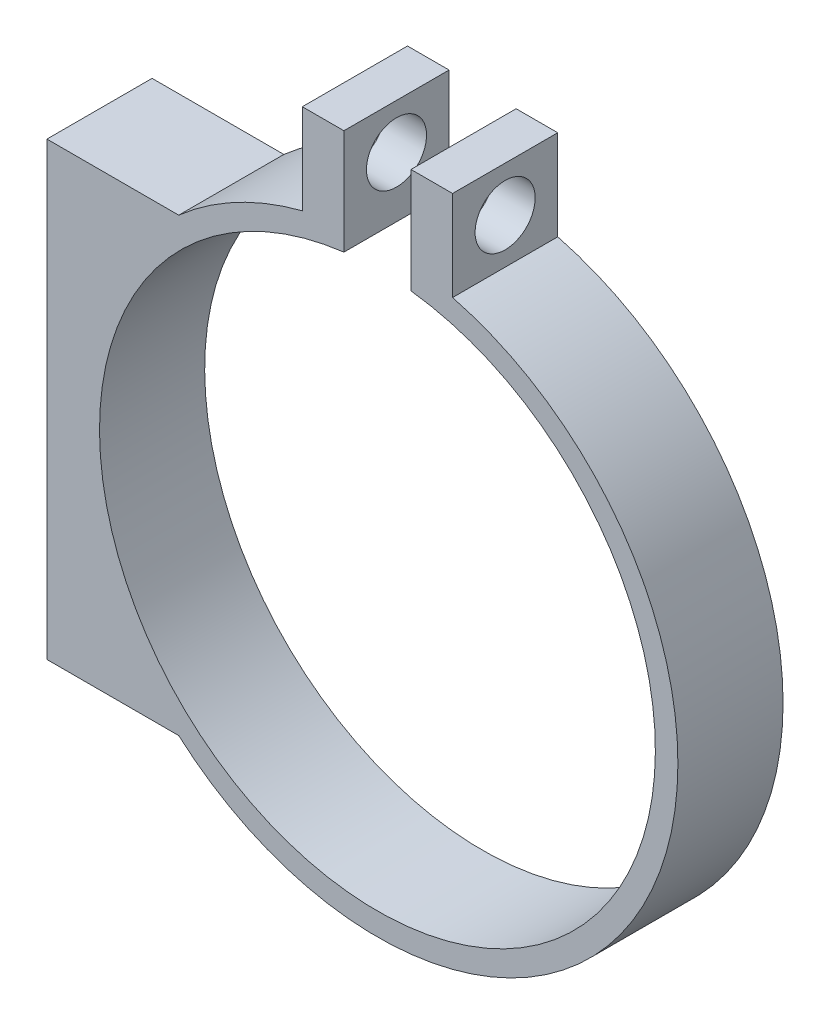
ISO-10303-21;
HEADER;
FILE_DESCRIPTION(('STEP AP214'),'2;1');
FILE_NAME('part.step','',(''),(''),'','','');
FILE_SCHEMA(('AUTOMOTIVE_DESIGN { 1 0 10303 214 1 1 1 1 }'));
ENDSEC;
DATA;
#1=APPLICATION_CONTEXT('core data for automotive mechanical design processes');
#2=APPLICATION_PROTOCOL_DEFINITION('international standard','automotive_design',2000,#1);
#3=PRODUCT_CONTEXT('',#1,'mechanical');
#4=PRODUCT('Part','Part','',(#3));
#5=PRODUCT_RELATED_PRODUCT_CATEGORY('part','',(#4));
#6=PRODUCT_DEFINITION_FORMATION('','',#4);
#7=PRODUCT_DEFINITION_CONTEXT('part definition',#1,'design');
#8=PRODUCT_DEFINITION('design','',#6,#7);
#9=PRODUCT_DEFINITION_SHAPE('','',#8);
#10=(LENGTH_UNIT() NAMED_UNIT(*) SI_UNIT(.MILLI.,.METRE.));
#11=(NAMED_UNIT(*) PLANE_ANGLE_UNIT() SI_UNIT($,.RADIAN.));
#12=(NAMED_UNIT(*) SI_UNIT($,.STERADIAN.) SOLID_ANGLE_UNIT());
#13=UNCERTAINTY_MEASURE_WITH_UNIT(LENGTH_MEASURE(1.E-05),#10,'distance_accuracy_value','');
#14=(GEOMETRIC_REPRESENTATION_CONTEXT(3) GLOBAL_UNCERTAINTY_ASSIGNED_CONTEXT((#13)) GLOBAL_UNIT_ASSIGNED_CONTEXT((#10,
#11,#12)) REPRESENTATION_CONTEXT('',''));
#15=CARTESIAN_POINT('',(0.,0.,0.));
#16=DIRECTION('',(0.,0.,1.));
#17=DIRECTION('',(1.,0.,0.));
#18=AXIS2_PLACEMENT_3D('',#15,#16,#17);
#19=CARTESIAN_POINT('',(-2.23155404641568,25.3649167310371,7.));
#20=DIRECTION('',(-1.,0.,0.));
#21=DIRECTION('',(0.,-1.,0.));
#22=AXIS2_PLACEMENT_3D('',#19,#20,#21);
#23=PLANE('',#22);
#24=CARTESIAN_POINT('',(-2.23155404641568,22.3649167310371,3.5));
#25=DIRECTION('',(-1.,0.,0.));
#26=DIRECTION('',(0.,-1.,0.));
#27=AXIS2_PLACEMENT_3D('',#24,#25,#26);
#28=CIRCLE('',#27,2.);
#29=CARTESIAN_POINT('',(-2.23155404641568,20.3649167310371,3.5));
#30=VERTEX_POINT('',#29);
#31=EDGE_CURVE('E265',#30,#30,#28,.T.);
#32=ORIENTED_EDGE('',*,*,#31,.T.);
#33=EDGE_LOOP('',(#32));
#34=FACE_BOUND('',#33,.T.);
#35=DIRECTION('',(0.,1.,0.));
#36=VECTOR('',#35,1.);
#37=CARTESIAN_POINT('',(-2.23155404641568,25.3649167310371,0.));
#38=LINE('',#37,#36);
#39=CARTESIAN_POINT('',(-2.23155404641568,18.3649167310371,0.));
#40=VERTEX_POINT('',#39);
#41=CARTESIAN_POINT('',(-2.23155404641568,25.3649167310371,0.));
#42=VERTEX_POINT('',#41);
#43=EDGE_CURVE('E155',#40,#42,#38,.T.);
#44=ORIENTED_EDGE('',*,*,#43,.T.);
#45=DIRECTION('',(0.,0.,-1.));
#46=VECTOR('',#45,1.);
#47=CARTESIAN_POINT('',(-2.23155404641568,25.3649167310371,7.));
#48=LINE('',#47,#46);
#49=CARTESIAN_POINT('',(-2.23155404641568,25.3649167310371,7.));
#50=VERTEX_POINT('',#49);
#51=EDGE_CURVE('E11',#50,#42,#48,.T.);
#52=ORIENTED_EDGE('',*,*,#51,.F.);
#53=DIRECTION('',(0.,1.,0.));
#54=VECTOR('',#53,1.);
#55=CARTESIAN_POINT('',(-2.23155404641568,25.3649167310371,7.));
#56=LINE('',#55,#54);
#57=CARTESIAN_POINT('',(-2.23155404641568,18.3649167310371,7.));
#58=VERTEX_POINT('',#57);
#59=EDGE_CURVE('E178',#58,#50,#56,.T.);
#60=ORIENTED_EDGE('',*,*,#59,.F.);
#61=DIRECTION('',(0.,0.,-1.));
#62=VECTOR('',#61,1.);
#63=CARTESIAN_POINT('',(-2.23155404641568,18.3649167310371,7.));
#64=LINE('',#63,#62);
#65=EDGE_CURVE('E151',#58,#40,#64,.T.);
#66=ORIENTED_EDGE('',*,*,#65,.T.);
#67=EDGE_LOOP('',(#44,#52,#60,#66));
#68=FACE_BOUND('',#67,.T.);
#69=ADVANCED_FACE('F34',(#34,#68),#23,.F.);
#70=CARTESIAN_POINT('',(-5.,25.3649167310371,7.));
#71=DIRECTION('',(0.,-1.,0.));
#72=DIRECTION('',(0.,0.,-1.));
#73=AXIS2_PLACEMENT_3D('',#70,#71,#72);
#74=PLANE('',#73);
#75=DIRECTION('',(-1.,0.,0.));
#76=VECTOR('',#75,1.);
#77=CARTESIAN_POINT('',(-5.,25.3649167310371,0.));
#78=LINE('',#77,#76);
#79=CARTESIAN_POINT('',(-5.,25.3649167310371,0.));
#80=VERTEX_POINT('',#79);
#81=EDGE_CURVE('E158',#42,#80,#78,.T.);
#82=ORIENTED_EDGE('',*,*,#81,.T.);
#83=DIRECTION('',(0.,0.,-1.));
#84=VECTOR('',#83,1.);
#85=CARTESIAN_POINT('',(-5.,25.3649167310371,7.));
#86=LINE('',#85,#84);
#87=CARTESIAN_POINT('',(-5.,25.3649167310371,7.));
#88=VERTEX_POINT('',#87);
#89=EDGE_CURVE('E43',#88,#80,#86,.T.);
#90=ORIENTED_EDGE('',*,*,#89,.F.);
#91=DIRECTION('',(-1.,0.,0.));
#92=VECTOR('',#91,1.);
#93=CARTESIAN_POINT('',(-5.,25.3649167310371,7.));
#94=LINE('',#93,#92);
#95=EDGE_CURVE('E106',#50,#88,#94,.T.);
#96=ORIENTED_EDGE('',*,*,#95,.F.);
#97=ORIENTED_EDGE('',*,*,#51,.T.);
#98=EDGE_LOOP('',(#82,#90,#96,#97));
#99=FACE_BOUND('',#98,.T.);
#100=ADVANCED_FACE('F258',(#99),#74,.F.);
#101=CARTESIAN_POINT('',(-5.,19.3649167310371,7.));
#102=DIRECTION('',(1.,0.,0.));
#103=DIRECTION('',(0.,1.,0.));
#104=AXIS2_PLACEMENT_3D('',#101,#102,#103);
#105=PLANE('',#104);
#106=CARTESIAN_POINT('',(-5.,22.3649167310371,3.5));
#107=DIRECTION('',(-1.,0.,0.));
#108=DIRECTION('',(0.,-1.,0.));
#109=AXIS2_PLACEMENT_3D('',#106,#107,#108);
#110=CIRCLE('',#109,2.);
#111=CARTESIAN_POINT('',(-5.,20.3649167310371,3.5));
#112=VERTEX_POINT('',#111);
#113=EDGE_CURVE('E322',#112,#112,#110,.T.);
#114=ORIENTED_EDGE('',*,*,#113,.F.);
#115=EDGE_LOOP('',(#114));
#116=FACE_BOUND('',#115,.T.);
#117=DIRECTION('',(0.,-1.,0.));
#118=VECTOR('',#117,1.);
#119=CARTESIAN_POINT('',(-5.,19.3649167310371,0.));
#120=LINE('',#119,#118);
#121=CARTESIAN_POINT('',(-5.,19.3649167310371,0.));
#122=VERTEX_POINT('',#121);
#123=EDGE_CURVE('E161',#80,#122,#120,.T.);
#124=ORIENTED_EDGE('',*,*,#123,.T.);
#125=DIRECTION('',(0.,0.,-1.));
#126=VECTOR('',#125,1.);
#127=CARTESIAN_POINT('',(-5.,19.3649167310371,7.));
#128=LINE('',#127,#126);
#129=CARTESIAN_POINT('',(-5.,19.3649167310371,7.));
#130=VERTEX_POINT('',#129);
#131=EDGE_CURVE('E197',#130,#122,#128,.T.);
#132=ORIENTED_EDGE('',*,*,#131,.F.);
#133=DIRECTION('',(0.,-1.,0.));
#134=VECTOR('',#133,1.);
#135=CARTESIAN_POINT('',(-5.,19.3649167310371,7.));
#136=LINE('',#135,#134);
#137=EDGE_CURVE('E206',#88,#130,#136,.T.);
#138=ORIENTED_EDGE('',*,*,#137,.F.);
#139=ORIENTED_EDGE('',*,*,#89,.T.);
#140=EDGE_LOOP('',(#124,#132,#138,#139));
#141=FACE_BOUND('',#140,.T.);
#142=ADVANCED_FACE('F204',(#116,#141),#105,.F.);
#143=CARTESIAN_POINT('',(0.,0.,7.));
#144=DIRECTION('',(0.,0.,-1.));
#145=DIRECTION('',(-1.,0.,0.));
#146=AXIS2_PLACEMENT_3D('',#143,#144,#145);
#147=CYLINDRICAL_SURFACE('',#146,20.);
#148=CARTESIAN_POINT('',(0.,0.,0.));
#149=DIRECTION('',(0.,0.,1.));
#150=DIRECTION('',(1.,0.,0.));
#151=AXIS2_PLACEMENT_3D('',#148,#149,#150);
#152=CIRCLE('',#151,20.);
#153=CARTESIAN_POINT('',(-13.228756555323,15.,0.));
#154=VERTEX_POINT('',#153);
#155=EDGE_CURVE('E163',#122,#154,#152,.T.);
#156=ORIENTED_EDGE('',*,*,#155,.T.);
#157=DIRECTION('',(0.,0.,-1.));
#158=VECTOR('',#157,1.);
#159=CARTESIAN_POINT('',(-13.228756555323,15.,7.));
#160=LINE('',#159,#158);
#161=CARTESIAN_POINT('',(-13.228756555323,15.,7.));
#162=VERTEX_POINT('',#161);
#163=EDGE_CURVE('E194',#162,#154,#160,.T.);
#164=ORIENTED_EDGE('',*,*,#163,.F.);
#165=CARTESIAN_POINT('',(0.,0.,7.));
#166=DIRECTION('',(0.,0.,1.));
#167=DIRECTION('',(1.,0.,0.));
#168=AXIS2_PLACEMENT_3D('',#165,#166,#167);
#169=CIRCLE('',#168,20.);
#170=EDGE_CURVE('E224',#130,#162,#169,.T.);
#171=ORIENTED_EDGE('',*,*,#170,.F.);
#172=ORIENTED_EDGE('',*,*,#131,.T.);
#173=EDGE_LOOP('',(#156,#164,#171,#172));
#174=FACE_BOUND('',#173,.T.);
#175=ADVANCED_FACE('F215',(#174),#147,.T.);
#176=CARTESIAN_POINT('',(-22.,15.,7.));
#177=DIRECTION('',(0.,-1.,0.));
#178=DIRECTION('',(0.,0.,-1.));
#179=AXIS2_PLACEMENT_3D('',#176,#177,#178);
#180=PLANE('',#179);
#181=DIRECTION('',(-1.,0.,0.));
#182=VECTOR('',#181,1.);
#183=CARTESIAN_POINT('',(-22.,15.,0.));
#184=LINE('',#183,#182);
#185=CARTESIAN_POINT('',(-22.,15.,0.));
#186=VERTEX_POINT('',#185);
#187=EDGE_CURVE('E165',#154,#186,#184,.T.);
#188=ORIENTED_EDGE('',*,*,#187,.T.);
#189=DIRECTION('',(0.,0.,-1.));
#190=VECTOR('',#189,1.);
#191=CARTESIAN_POINT('',(-22.,15.,7.));
#192=LINE('',#191,#190);
#193=CARTESIAN_POINT('',(-22.,15.,7.));
#194=VERTEX_POINT('',#193);
#195=EDGE_CURVE('E191',#194,#186,#192,.T.);
#196=ORIENTED_EDGE('',*,*,#195,.F.);
#197=DIRECTION('',(-1.,0.,0.));
#198=VECTOR('',#197,1.);
#199=CARTESIAN_POINT('',(-22.,15.,7.));
#200=LINE('',#199,#198);
#201=EDGE_CURVE('E221',#162,#194,#200,.T.);
#202=ORIENTED_EDGE('',*,*,#201,.F.);
#203=ORIENTED_EDGE('',*,*,#163,.T.);
#204=EDGE_LOOP('',(#188,#196,#202,#203));
#205=FACE_BOUND('',#204,.T.);
#206=ADVANCED_FACE('F219',(#205),#180,.F.);
#207=CARTESIAN_POINT('',(-22.,-15.,7.));
#208=DIRECTION('',(1.,0.,0.));
#209=DIRECTION('',(0.,0.,-1.));
#210=AXIS2_PLACEMENT_3D('',#207,#208,#209);
#211=PLANE('',#210);
#212=CARTESIAN_POINT('',(-22.,12.5,3.5));
#213=DIRECTION('',(-1.,0.,0.));
#214=DIRECTION('',(0.,0.,1.));
#215=AXIS2_PLACEMENT_3D('',#212,#213,#214);
#216=CIRCLE('',#215,1.75);
#217=CARTESIAN_POINT('',(-22.,12.5,5.25));
#218=VERTEX_POINT('',#217);
#219=EDGE_CURVE('E279',#218,#218,#216,.T.);
#220=ORIENTED_EDGE('',*,*,#219,.F.);
#221=EDGE_LOOP('',(#220));
#222=FACE_BOUND('',#221,.T.);
#223=CARTESIAN_POINT('',(-22.,-12.5,3.5));
#224=DIRECTION('',(-1.,0.,0.));
#225=DIRECTION('',(0.,0.,1.));
#226=AXIS2_PLACEMENT_3D('',#223,#224,#225);
#227=CIRCLE('',#226,1.75);
#228=CARTESIAN_POINT('',(-22.,-12.5,5.25));
#229=VERTEX_POINT('',#228);
#230=EDGE_CURVE('E267',#229,#229,#227,.T.);
#231=ORIENTED_EDGE('',*,*,#230,.F.);
#232=EDGE_LOOP('',(#231));
#233=FACE_BOUND('',#232,.T.);
#234=DIRECTION('',(0.,-1.,0.));
#235=VECTOR('',#234,1.);
#236=CARTESIAN_POINT('',(-22.,-15.,0.));
#237=LINE('',#236,#235);
#238=CARTESIAN_POINT('',(-22.,-15.,0.));
#239=VERTEX_POINT('',#238);
#240=EDGE_CURVE('E167',#186,#239,#237,.T.);
#241=ORIENTED_EDGE('',*,*,#240,.T.);
#242=DIRECTION('',(0.,0.,-1.));
#243=VECTOR('',#242,1.);
#244=CARTESIAN_POINT('',(-22.,-15.,7.));
#245=LINE('',#244,#243);
#246=CARTESIAN_POINT('',(-22.,-15.,7.));
#247=VERTEX_POINT('',#246);
#248=EDGE_CURVE('E188',#247,#239,#245,.T.);
#249=ORIENTED_EDGE('',*,*,#248,.F.);
#250=DIRECTION('',(0.,-1.,0.));
#251=VECTOR('',#250,1.);
#252=CARTESIAN_POINT('',(-22.,-15.,7.));
#253=LINE('',#252,#251);
#254=EDGE_CURVE('E223',#194,#247,#253,.T.);
#255=ORIENTED_EDGE('',*,*,#254,.F.);
#256=ORIENTED_EDGE('',*,*,#195,.T.);
#257=EDGE_LOOP('',(#241,#249,#255,#256));
#258=FACE_BOUND('',#257,.T.);
#259=ADVANCED_FACE('F295',(#222,#233,#258),#211,.F.);
#260=CARTESIAN_POINT('',(-22.,-15.,7.));
#261=DIRECTION('',(0.,1.,0.));
#262=DIRECTION('',(0.,0.,1.));
#263=AXIS2_PLACEMENT_3D('',#260,#261,#262);
#264=PLANE('',#263);
#265=DIRECTION('',(1.,0.,0.));
#266=VECTOR('',#265,1.);
#267=CARTESIAN_POINT('',(-22.,-15.,0.));
#268=LINE('',#267,#266);
#269=CARTESIAN_POINT('',(-13.228756555323,-15.,0.));
#270=VERTEX_POINT('',#269);
#271=EDGE_CURVE('E169',#239,#270,#268,.T.);
#272=ORIENTED_EDGE('',*,*,#271,.T.);
#273=DIRECTION('',(0.,0.,-1.));
#274=VECTOR('',#273,1.);
#275=CARTESIAN_POINT('',(-13.228756555323,-15.,7.));
#276=LINE('',#275,#274);
#277=CARTESIAN_POINT('',(-13.228756555323,-15.,7.));
#278=VERTEX_POINT('',#277);
#279=EDGE_CURVE('E185',#278,#270,#276,.T.);
#280=ORIENTED_EDGE('',*,*,#279,.F.);
#281=DIRECTION('',(1.,0.,0.));
#282=VECTOR('',#281,1.);
#283=CARTESIAN_POINT('',(-22.,-15.,7.));
#284=LINE('',#283,#282);
#285=EDGE_CURVE('E226',#247,#278,#284,.T.);
#286=ORIENTED_EDGE('',*,*,#285,.F.);
#287=ORIENTED_EDGE('',*,*,#248,.T.);
#288=EDGE_LOOP('',(#272,#280,#286,#287));
#289=FACE_BOUND('',#288,.T.);
#290=ADVANCED_FACE('F298',(#289),#264,.F.);
#291=CARTESIAN_POINT('',(0.,0.,7.));
#292=DIRECTION('',(0.,0.,-1.));
#293=DIRECTION('',(-1.,0.,0.));
#294=AXIS2_PLACEMENT_3D('',#291,#292,#293);
#295=CYLINDRICAL_SURFACE('',#294,20.);
#296=CARTESIAN_POINT('',(0.,0.,0.));
#297=DIRECTION('',(0.,0.,1.));
#298=DIRECTION('',(1.,0.,0.));
#299=AXIS2_PLACEMENT_3D('',#296,#297,#298);
#300=CIRCLE('',#299,20.);
#301=CARTESIAN_POINT('',(5.,19.3649167310371,0.));
#302=VERTEX_POINT('',#301);
#303=EDGE_CURVE('E171',#270,#302,#300,.T.);
#304=ORIENTED_EDGE('',*,*,#303,.T.);
#305=DIRECTION('',(0.,0.,-1.));
#306=VECTOR('',#305,1.);
#307=CARTESIAN_POINT('',(5.,19.3649167310371,7.));
#308=LINE('',#307,#306);
#309=CARTESIAN_POINT('',(5.,19.3649167310371,7.));
#310=VERTEX_POINT('',#309);
#311=EDGE_CURVE('E182',#310,#302,#308,.T.);
#312=ORIENTED_EDGE('',*,*,#311,.F.);
#313=CARTESIAN_POINT('',(0.,0.,7.));
#314=DIRECTION('',(0.,0.,1.));
#315=DIRECTION('',(1.,0.,0.));
#316=AXIS2_PLACEMENT_3D('',#313,#314,#315);
#317=CIRCLE('',#316,20.);
#318=EDGE_CURVE('E232',#278,#310,#317,.T.);
#319=ORIENTED_EDGE('',*,*,#318,.F.);
#320=ORIENTED_EDGE('',*,*,#279,.T.);
#321=EDGE_LOOP('',(#304,#312,#319,#320));
#322=FACE_BOUND('',#321,.T.);
#323=ADVANCED_FACE('F238',(#322),#295,.T.);
#324=CARTESIAN_POINT('',(5.,25.3649167310371,7.));
#325=DIRECTION('',(-1.,0.,0.));
#326=DIRECTION('',(0.,-1.,0.));
#327=AXIS2_PLACEMENT_3D('',#324,#325,#326);
#328=PLANE('',#327);
#329=CARTESIAN_POINT('',(5.,22.3649167310371,3.5));
#330=DIRECTION('',(-1.,0.,0.));
#331=DIRECTION('',(0.,-1.,0.));
#332=AXIS2_PLACEMENT_3D('',#329,#330,#331);
#333=CIRCLE('',#332,2.);
#334=CARTESIAN_POINT('',(5.,20.3649167310371,3.5));
#335=VERTEX_POINT('',#334);
#336=EDGE_CURVE('E268',#335,#335,#333,.T.);
#337=ORIENTED_EDGE('',*,*,#336,.T.);
#338=EDGE_LOOP('',(#337));
#339=FACE_BOUND('',#338,.T.);
#340=DIRECTION('',(0.,1.,0.));
#341=VECTOR('',#340,1.);
#342=CARTESIAN_POINT('',(5.,25.3649167310371,0.));
#343=LINE('',#342,#341);
#344=CARTESIAN_POINT('',(5.,25.3649167310371,0.));
#345=VERTEX_POINT('',#344);
#346=EDGE_CURVE('E173',#302,#345,#343,.T.);
#347=ORIENTED_EDGE('',*,*,#346,.T.);
#348=DIRECTION('',(0.,0.,-1.));
#349=VECTOR('',#348,1.);
#350=CARTESIAN_POINT('',(5.,25.3649167310371,7.));
#351=LINE('',#350,#349);
#352=CARTESIAN_POINT('',(5.,25.3649167310371,7.));
#353=VERTEX_POINT('',#352);
#354=EDGE_CURVE('E146',#353,#345,#351,.T.);
#355=ORIENTED_EDGE('',*,*,#354,.F.);
#356=DIRECTION('',(0.,1.,0.));
#357=VECTOR('',#356,1.);
#358=CARTESIAN_POINT('',(5.,25.3649167310371,7.));
#359=LINE('',#358,#357);
#360=EDGE_CURVE('E137',#310,#353,#359,.T.);
#361=ORIENTED_EDGE('',*,*,#360,.F.);
#362=ORIENTED_EDGE('',*,*,#311,.T.);
#363=EDGE_LOOP('',(#347,#355,#361,#362));
#364=FACE_BOUND('',#363,.T.);
#365=ADVANCED_FACE('F242',(#339,#364),#328,.F.);
#366=CARTESIAN_POINT('',(2.23155404641567,25.3649167310371,7.));
#367=DIRECTION('',(0.,-1.,0.));
#368=DIRECTION('',(0.,0.,-1.));
#369=AXIS2_PLACEMENT_3D('',#366,#367,#368);
#370=PLANE('',#369);
#371=DIRECTION('',(-1.,0.,0.));
#372=VECTOR('',#371,1.);
#373=CARTESIAN_POINT('',(2.23155404641567,25.3649167310371,0.));
#374=LINE('',#373,#372);
#375=CARTESIAN_POINT('',(2.23155404641567,25.3649167310371,0.));
#376=VERTEX_POINT('',#375);
#377=EDGE_CURVE('E145',#345,#376,#374,.T.);
#378=ORIENTED_EDGE('',*,*,#377,.T.);
#379=DIRECTION('',(0.,0.,-1.));
#380=VECTOR('',#379,1.);
#381=CARTESIAN_POINT('',(2.23155404641567,25.3649167310371,7.));
#382=LINE('',#381,#380);
#383=CARTESIAN_POINT('',(2.23155404641567,25.3649167310371,7.));
#384=VERTEX_POINT('',#383);
#385=EDGE_CURVE('E142',#384,#376,#382,.T.);
#386=ORIENTED_EDGE('',*,*,#385,.F.);
#387=DIRECTION('',(-1.,0.,0.));
#388=VECTOR('',#387,1.);
#389=CARTESIAN_POINT('',(2.23155404641567,25.3649167310371,7.));
#390=LINE('',#389,#388);
#391=EDGE_CURVE('E131',#353,#384,#390,.T.);
#392=ORIENTED_EDGE('',*,*,#391,.F.);
#393=ORIENTED_EDGE('',*,*,#354,.T.);
#394=EDGE_LOOP('',(#378,#386,#392,#393));
#395=FACE_BOUND('',#394,.T.);
#396=ADVANCED_FACE('F143',(#395),#370,.F.);
#397=CARTESIAN_POINT('',(2.23155404641567,25.3649167310371,7.));
#398=DIRECTION('',(1.,0.,0.));
#399=DIRECTION('',(0.,1.,0.));
#400=AXIS2_PLACEMENT_3D('',#397,#398,#399);
#401=PLANE('',#400);
#402=CARTESIAN_POINT('',(2.23155404641567,22.3649167310371,3.5));
#403=DIRECTION('',(1.,0.,0.));
#404=DIRECTION('',(0.,1.,0.));
#405=AXIS2_PLACEMENT_3D('',#402,#403,#404);
#406=CIRCLE('',#405,2.);
#407=CARTESIAN_POINT('',(2.23155404641567,24.3649167310371,3.5));
#408=VERTEX_POINT('',#407);
#409=EDGE_CURVE('E37',#408,#408,#406,.T.);
#410=ORIENTED_EDGE('',*,*,#409,.T.);
#411=EDGE_LOOP('',(#410));
#412=FACE_BOUND('',#411,.T.);
#413=DIRECTION('',(0.,-1.,0.));
#414=VECTOR('',#413,1.);
#415=CARTESIAN_POINT('',(2.23155404641567,25.3649167310371,0.));
#416=LINE('',#415,#414);
#417=CARTESIAN_POINT('',(2.23155404641567,18.3649167310371,0.));
#418=VERTEX_POINT('',#417);
#419=EDGE_CURVE('E92',#376,#418,#416,.T.);
#420=ORIENTED_EDGE('',*,*,#419,.T.);
#421=DIRECTION('',(0.,0.,-1.));
#422=VECTOR('',#421,1.);
#423=CARTESIAN_POINT('',(2.23155404641567,18.3649167310371,7.));
#424=LINE('',#423,#422);
#425=CARTESIAN_POINT('',(2.23155404641567,18.3649167310371,7.));
#426=VERTEX_POINT('',#425);
#427=EDGE_CURVE('E147',#426,#418,#424,.T.);
#428=ORIENTED_EDGE('',*,*,#427,.F.);
#429=DIRECTION('',(0.,-1.,0.));
#430=VECTOR('',#429,1.);
#431=CARTESIAN_POINT('',(2.23155404641567,25.3649167310371,7.));
#432=LINE('',#431,#430);
#433=EDGE_CURVE('E135',#384,#426,#432,.T.);
#434=ORIENTED_EDGE('',*,*,#433,.F.);
#435=ORIENTED_EDGE('',*,*,#385,.T.);
#436=EDGE_LOOP('',(#420,#428,#434,#435));
#437=FACE_BOUND('',#436,.T.);
#438=ADVANCED_FACE('F149',(#412,#437),#401,.F.);
#439=CARTESIAN_POINT('',(0.,0.,7.));
#440=DIRECTION('',(0.,0.,-1.));
#441=DIRECTION('',(-1.,0.,0.));
#442=AXIS2_PLACEMENT_3D('',#439,#440,#441);
#443=CYLINDRICAL_SURFACE('',#442,18.5);
#444=CARTESIAN_POINT('',(0.,0.,0.));
#445=DIRECTION('',(0.,0.,-1.));
#446=DIRECTION('',(1.,0.,0.));
#447=AXIS2_PLACEMENT_3D('',#444,#445,#446);
#448=CIRCLE('',#447,18.5);
#449=EDGE_CURVE('E98',#418,#40,#448,.T.);
#450=ORIENTED_EDGE('',*,*,#449,.T.);
#451=ORIENTED_EDGE('',*,*,#65,.F.);
#452=CARTESIAN_POINT('',(0.,0.,7.));
#453=DIRECTION('',(0.,0.,-1.));
#454=DIRECTION('',(1.,0.,0.));
#455=AXIS2_PLACEMENT_3D('',#452,#453,#454);
#456=CIRCLE('',#455,18.5);
#457=EDGE_CURVE('E51',#426,#58,#456,.T.);
#458=ORIENTED_EDGE('',*,*,#457,.F.);
#459=ORIENTED_EDGE('',*,*,#427,.T.);
#460=EDGE_LOOP('',(#450,#451,#458,#459));
#461=FACE_BOUND('',#460,.T.);
#462=ADVANCED_FACE('F246',(#461),#443,.F.);
#463=CARTESIAN_POINT('',(0.,0.,7.));
#464=DIRECTION('',(0.,0.,1.));
#465=DIRECTION('',(1.,0.,0.));
#466=AXIS2_PLACEMENT_3D('',#463,#464,#465);
#467=PLANE('',#466);
#468=ORIENTED_EDGE('',*,*,#59,.T.);
#469=ORIENTED_EDGE('',*,*,#95,.T.);
#470=ORIENTED_EDGE('',*,*,#137,.T.);
#471=ORIENTED_EDGE('',*,*,#170,.T.);
#472=ORIENTED_EDGE('',*,*,#201,.T.);
#473=ORIENTED_EDGE('',*,*,#254,.T.);
#474=ORIENTED_EDGE('',*,*,#285,.T.);
#475=ORIENTED_EDGE('',*,*,#318,.T.);
#476=ORIENTED_EDGE('',*,*,#360,.T.);
#477=ORIENTED_EDGE('',*,*,#391,.T.);
#478=ORIENTED_EDGE('',*,*,#433,.T.);
#479=ORIENTED_EDGE('',*,*,#457,.T.);
#480=EDGE_LOOP('',(#468,#469,#470,#471,#472,#473,#474,#475,#476,#477,#478,#479));
#481=FACE_BOUND('',#480,.T.);
#482=ADVANCED_FACE('F133',(#481),#467,.T.);
#483=CARTESIAN_POINT('',(0.,0.,0.));
#484=DIRECTION('',(0.,0.,1.));
#485=DIRECTION('',(1.,0.,0.));
#486=AXIS2_PLACEMENT_3D('',#483,#484,#485);
#487=PLANE('',#486);
#488=ORIENTED_EDGE('',*,*,#43,.F.);
#489=ORIENTED_EDGE('',*,*,#449,.F.);
#490=ORIENTED_EDGE('',*,*,#419,.F.);
#491=ORIENTED_EDGE('',*,*,#377,.F.);
#492=ORIENTED_EDGE('',*,*,#346,.F.);
#493=ORIENTED_EDGE('',*,*,#303,.F.);
#494=ORIENTED_EDGE('',*,*,#271,.F.);
#495=ORIENTED_EDGE('',*,*,#240,.F.);
#496=ORIENTED_EDGE('',*,*,#187,.F.);
#497=ORIENTED_EDGE('',*,*,#155,.F.);
#498=ORIENTED_EDGE('',*,*,#123,.F.);
#499=ORIENTED_EDGE('',*,*,#81,.F.);
#500=EDGE_LOOP('',(#488,#489,#490,#491,#492,#493,#494,#495,#496,#497,#498,#499));
#501=FACE_BOUND('',#500,.T.);
#502=ADVANCED_FACE('F210',(#501),#487,.F.);
#503=CARTESIAN_POINT('',(-17.,-12.5,3.5));
#504=DIRECTION('',(-1.,0.,0.));
#505=DIRECTION('',(0.,0.,1.));
#506=AXIS2_PLACEMENT_3D('',#503,#504,#505);
#507=CYLINDRICAL_SURFACE('',#506,1.75);
#508=CARTESIAN_POINT('',(-17.,-12.5,3.5));
#509=DIRECTION('',(-1.,0.,0.));
#510=DIRECTION('',(0.,0.,1.));
#511=AXIS2_PLACEMENT_3D('',#508,#509,#510);
#512=CIRCLE('',#511,1.75);
#513=CARTESIAN_POINT('',(-17.,-12.5,5.25));
#514=VERTEX_POINT('',#513);
#515=EDGE_CURVE('E271',#514,#514,#512,.T.);
#516=ORIENTED_EDGE('',*,*,#515,.F.);
#517=EDGE_LOOP('',(#516));
#518=FACE_BOUND('',#517,.T.);
#519=ORIENTED_EDGE('',*,*,#230,.T.);
#520=EDGE_LOOP('',(#519));
#521=FACE_BOUND('',#520,.T.);
#522=ADVANCED_FACE('F289',(#518,#521),#507,.F.);
#523=CARTESIAN_POINT('',(-17.,-12.5,3.5));
#524=DIRECTION('',(-1.,0.,0.));
#525=DIRECTION('',(0.,0.,1.));
#526=AXIS2_PLACEMENT_3D('',#523,#524,#525);
#527=PLANE('',#526);
#528=ORIENTED_EDGE('',*,*,#515,.T.);
#529=EDGE_LOOP('',(#528));
#530=FACE_BOUND('',#529,.T.);
#531=ADVANCED_FACE('F287',(#530),#527,.T.);
#532=CARTESIAN_POINT('',(-17.,12.5,3.5));
#533=DIRECTION('',(-1.,0.,0.));
#534=DIRECTION('',(0.,0.,1.));
#535=AXIS2_PLACEMENT_3D('',#532,#533,#534);
#536=CYLINDRICAL_SURFACE('',#535,1.75);
#537=CARTESIAN_POINT('',(-17.,12.5,3.5));
#538=DIRECTION('',(-1.,0.,0.));
#539=DIRECTION('',(0.,0.,1.));
#540=AXIS2_PLACEMENT_3D('',#537,#538,#539);
#541=CIRCLE('',#540,1.75);
#542=CARTESIAN_POINT('',(-17.,12.5,5.25));
#543=VERTEX_POINT('',#542);
#544=EDGE_CURVE('E159',#543,#543,#541,.T.);
#545=ORIENTED_EDGE('',*,*,#544,.F.);
#546=EDGE_LOOP('',(#545));
#547=FACE_BOUND('',#546,.T.);
#548=ORIENTED_EDGE('',*,*,#219,.T.);
#549=EDGE_LOOP('',(#548));
#550=FACE_BOUND('',#549,.T.);
#551=ADVANCED_FACE('F371',(#547,#550),#536,.F.);
#552=CARTESIAN_POINT('',(-17.,12.5,3.5));
#553=DIRECTION('',(-1.,0.,0.));
#554=DIRECTION('',(0.,0.,1.));
#555=AXIS2_PLACEMENT_3D('',#552,#553,#554);
#556=PLANE('',#555);
#557=ORIENTED_EDGE('',*,*,#544,.T.);
#558=EDGE_LOOP('',(#557));
#559=FACE_BOUND('',#558,.T.);
#560=ADVANCED_FACE('F331',(#559),#556,.T.);
#561=CARTESIAN_POINT('',(10.,22.3649167310371,3.5));
#562=DIRECTION('',(-1.,0.,0.));
#563=DIRECTION('',(0.,-1.,0.));
#564=AXIS2_PLACEMENT_3D('',#561,#562,#563);
#565=CYLINDRICAL_SURFACE('',#564,2.);
#566=ORIENTED_EDGE('',*,*,#409,.F.);
#567=EDGE_LOOP('',(#566));
#568=FACE_BOUND('',#567,.T.);
#569=ORIENTED_EDGE('',*,*,#336,.F.);
#570=EDGE_LOOP('',(#569));
#571=FACE_BOUND('',#570,.T.);
#572=ADVANCED_FACE('F327',(#568,#571),#565,.F.);
#573=ORIENTED_EDGE('',*,*,#113,.T.);
#574=EDGE_LOOP('',(#573));
#575=FACE_BOUND('',#574,.T.);
#576=ORIENTED_EDGE('',*,*,#31,.F.);
#577=EDGE_LOOP('',(#576));
#578=FACE_BOUND('',#577,.T.);
#579=ADVANCED_FACE('F330',(#575,#578),#565,.F.);
#580=CLOSED_SHELL('',(#69,#100,#142,#175,#206,#259,#290,#323,#365,#396,#438,#462,#482,#502,#522,
#531,#551,#560,#572,#579));
#581=MANIFOLD_SOLID_BREP('B2',#580);
#582=ADVANCED_BREP_SHAPE_REPRESENTATION('',(#18,#581),#14);
#583=SHAPE_DEFINITION_REPRESENTATION(#9,#582);
ENDSEC;
END-ISO-10303-21;
